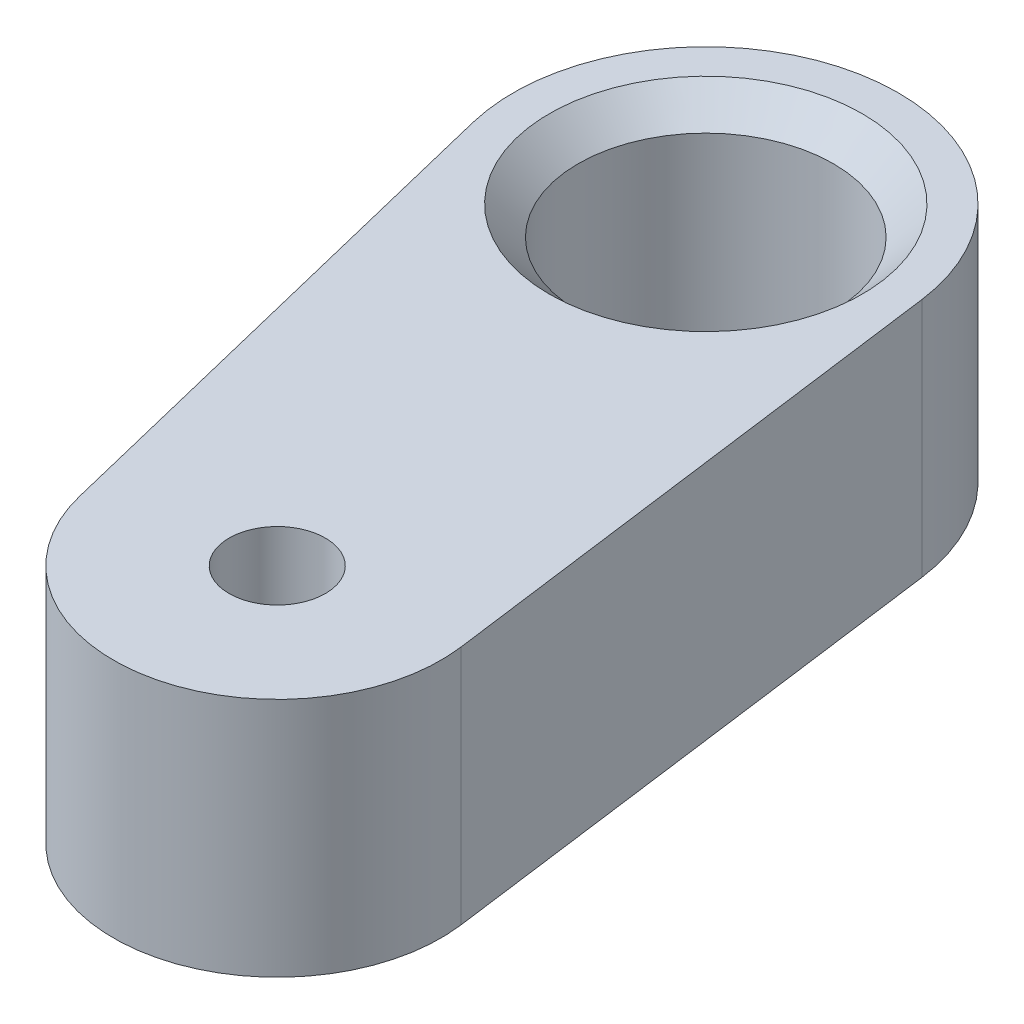
ISO-10303-21;
HEADER;
FILE_DESCRIPTION(('STEP AP214'),'2;1');
FILE_NAME('part.step','',(''),(''),'','','');
FILE_SCHEMA(('AUTOMOTIVE_DESIGN { 1 0 10303 214 1 1 1 1 }'));
ENDSEC;
DATA;
#1=APPLICATION_CONTEXT('core data for automotive mechanical design processes');
#2=APPLICATION_PROTOCOL_DEFINITION('international standard','automotive_design',2000,#1);
#3=PRODUCT_CONTEXT('',#1,'mechanical');
#4=PRODUCT('Part','Part','',(#3));
#5=PRODUCT_RELATED_PRODUCT_CATEGORY('part','',(#4));
#6=PRODUCT_DEFINITION_FORMATION('','',#4);
#7=PRODUCT_DEFINITION_CONTEXT('part definition',#1,'design');
#8=PRODUCT_DEFINITION('design','',#6,#7);
#9=PRODUCT_DEFINITION_SHAPE('','',#8);
#10=(LENGTH_UNIT() NAMED_UNIT(*) SI_UNIT(.MILLI.,.METRE.));
#11=(NAMED_UNIT(*) PLANE_ANGLE_UNIT() SI_UNIT($,.RADIAN.));
#12=(NAMED_UNIT(*) SI_UNIT($,.STERADIAN.) SOLID_ANGLE_UNIT());
#13=UNCERTAINTY_MEASURE_WITH_UNIT(LENGTH_MEASURE(1.E-05),#10,'distance_accuracy_value','');
#14=(GEOMETRIC_REPRESENTATION_CONTEXT(3) GLOBAL_UNCERTAINTY_ASSIGNED_CONTEXT((#13)) GLOBAL_UNIT_ASSIGNED_CONTEXT((#10,
#11,#12)) REPRESENTATION_CONTEXT('',''));
#15=CARTESIAN_POINT('',(0.,0.,0.));
#16=DIRECTION('',(0.,0.,1.));
#17=DIRECTION('',(1.,0.,0.));
#18=AXIS2_PLACEMENT_3D('',#15,#16,#17);
#19=CARTESIAN_POINT('',(0.,36.2,0.));
#20=DIRECTION('',(0.,-1.,0.));
#21=DIRECTION('',(0.,0.,-1.));
#22=AXIS2_PLACEMENT_3D('',#19,#20,#21);
#23=CYLINDRICAL_SURFACE('',#22,4.);
#24=CARTESIAN_POINT('',(0.,33.,0.));
#25=DIRECTION('',(0.,1.,0.));
#26=DIRECTION('',(0.,0.,1.));
#27=AXIS2_PLACEMENT_3D('',#24,#25,#26);
#28=CIRCLE('',#27,4.);
#29=CARTESIAN_POINT('',(3.96526743426604,33.,-0.52597925315473));
#30=VERTEX_POINT('',#29);
#31=CARTESIAN_POINT('',(-3.8858232577105,33.,0.948882295037764));
#32=VERTEX_POINT('',#31);
#33=EDGE_CURVE('E112',#30,#32,#28,.T.);
#34=ORIENTED_EDGE('',*,*,#33,.T.);
#35=DIRECTION('',(0.,-1.,0.));
#36=VECTOR('',#35,1.);
#37=CARTESIAN_POINT('',(-3.8858232577105,36.2,0.948882295037764));
#38=LINE('',#37,#36);
#39=CARTESIAN_POINT('',(-3.8858232577105,38.,0.948882295037763));
#40=VERTEX_POINT('',#39);
#41=EDGE_CURVE('E109',#40,#32,#38,.T.);
#42=ORIENTED_EDGE('',*,*,#41,.F.);
#43=CARTESIAN_POINT('',(0.,38.,0.));
#44=DIRECTION('',(0.,1.,0.));
#45=DIRECTION('',(0.,0.,1.));
#46=AXIS2_PLACEMENT_3D('',#43,#44,#45);
#47=CIRCLE('',#46,4.);
#48=CARTESIAN_POINT('',(3.96526743426604,38.,-0.52597925315473));
#49=VERTEX_POINT('',#48);
#50=EDGE_CURVE('E111',#49,#40,#47,.T.);
#51=ORIENTED_EDGE('',*,*,#50,.F.);
#52=DIRECTION('',(0.,-1.,0.));
#53=VECTOR('',#52,1.);
#54=CARTESIAN_POINT('',(3.96526743426604,36.2,-0.52597925315473));
#55=LINE('',#54,#53);
#56=EDGE_CURVE('E83',#49,#30,#55,.T.);
#57=ORIENTED_EDGE('',*,*,#56,.T.);
#58=EDGE_LOOP('',(#34,#42,#51,#57));
#59=FACE_BOUND('',#58,.T.);
#60=ADVANCED_FACE('F68',(#59),#23,.T.);
#61=CARTESIAN_POINT('',(-3.8858232577105,36.2,0.948882295037763));
#62=DIRECTION('',(0.971455814427626,0.,-0.237220573759441));
#63=DIRECTION('',(-0.237220573759441,0.,-0.971455814427626));
#64=AXIS2_PLACEMENT_3D('',#61,#62,#63);
#65=PLANE('',#64);
#66=DIRECTION('',(0.237220573759441,0.,0.971455814427626));
#67=VECTOR('',#66,1.);
#68=CARTESIAN_POINT('',(-3.8858232577105,33.,0.948882295037763));
#69=LINE('',#68,#67);
#70=CARTESIAN_POINT('',(-1.24345838330055,33.,11.7697848854174));
#71=VERTEX_POINT('',#70);
#72=EDGE_CURVE('E143',#32,#71,#69,.T.);
#73=ORIENTED_EDGE('',*,*,#72,.T.);
#74=DIRECTION('',(0.,-1.,0.));
#75=VECTOR('',#74,1.);
#76=CARTESIAN_POINT('',(-1.24345838330055,36.2,11.7697848854174));
#77=LINE('',#76,#75);
#78=CARTESIAN_POINT('',(-1.24345838330055,38.,11.7697848854174));
#79=VERTEX_POINT('',#78);
#80=EDGE_CURVE('E116',#79,#71,#77,.T.);
#81=ORIENTED_EDGE('',*,*,#80,.F.);
#82=DIRECTION('',(-0.237220573759441,0.,-0.971455814427626));
#83=VECTOR('',#82,1.);
#84=CARTESIAN_POINT('',(-3.8858232577105,38.,0.948882295037763));
#85=LINE('',#84,#83);
#86=EDGE_CURVE('E123',#79,#40,#85,.T.);
#87=ORIENTED_EDGE('',*,*,#86,.T.);
#88=ORIENTED_EDGE('',*,*,#41,.T.);
#89=EDGE_LOOP('',(#73,#81,#87,#88));
#90=FACE_BOUND('',#89,.T.);
#91=ADVANCED_FACE('F126',(#90),#65,.F.);
#92=CARTESIAN_POINT('',(2.05949138575338,36.2,10.9632349346353));
#93=DIRECTION('',(0.,-1.,0.));
#94=DIRECTION('',(0.,0.,-1.));
#95=AXIS2_PLACEMENT_3D('',#92,#93,#94);
#96=CYLINDRICAL_SURFACE('',#95,3.4);
#97=CARTESIAN_POINT('',(2.05949138575338,33.,10.9632349346353));
#98=DIRECTION('',(0.,1.,0.));
#99=DIRECTION('',(0.,0.,1.));
#100=AXIS2_PLACEMENT_3D('',#97,#98,#99);
#101=CIRCLE('',#100,3.4);
#102=CARTESIAN_POINT('',(5.42996870487952,33.,10.5161525694538));
#103=VERTEX_POINT('',#102);
#104=EDGE_CURVE('E145',#71,#103,#101,.T.);
#105=ORIENTED_EDGE('',*,*,#104,.T.);
#106=DIRECTION('',(0.,-1.,0.));
#107=VECTOR('',#106,1.);
#108=CARTESIAN_POINT('',(5.42996870487952,36.2,10.5161525694538));
#109=LINE('',#108,#107);
#110=CARTESIAN_POINT('',(5.42996870487952,38.,10.5161525694538));
#111=VERTEX_POINT('',#110);
#112=EDGE_CURVE('E91',#111,#103,#109,.T.);
#113=ORIENTED_EDGE('',*,*,#112,.F.);
#114=CARTESIAN_POINT('',(2.05949138575338,38.,10.9632349346353));
#115=DIRECTION('',(0.,1.,0.));
#116=DIRECTION('',(0.,0.,1.));
#117=AXIS2_PLACEMENT_3D('',#114,#115,#116);
#118=CIRCLE('',#117,3.4);
#119=EDGE_CURVE('E137',#79,#111,#118,.T.);
#120=ORIENTED_EDGE('',*,*,#119,.F.);
#121=ORIENTED_EDGE('',*,*,#80,.T.);
#122=EDGE_LOOP('',(#105,#113,#120,#121));
#123=FACE_BOUND('',#122,.T.);
#124=ADVANCED_FACE('F183',(#123),#96,.T.);
#125=CARTESIAN_POINT('',(3.96526743426604,36.2,-0.52597925315473));
#126=DIRECTION('',(0.99131685856651,0.,-0.131494813288683));
#127=DIRECTION('',(-0.131494813288683,0.,-0.99131685856651));
#128=AXIS2_PLACEMENT_3D('',#125,#126,#127);
#129=PLANE('',#128);
#130=DIRECTION('',(0.131494813288683,0.,0.99131685856651));
#131=VECTOR('',#130,1.);
#132=CARTESIAN_POINT('',(3.96526743426604,33.,-0.52597925315473));
#133=LINE('',#132,#131);
#134=EDGE_CURVE('E147',#30,#103,#133,.T.);
#135=ORIENTED_EDGE('',*,*,#134,.F.);
#136=ORIENTED_EDGE('',*,*,#56,.F.);
#137=DIRECTION('',(-0.131494813288683,0.,-0.99131685856651));
#138=VECTOR('',#137,1.);
#139=CARTESIAN_POINT('',(3.96526743426604,38.,-0.52597925315473));
#140=LINE('',#139,#138);
#141=EDGE_CURVE('E124',#111,#49,#140,.T.);
#142=ORIENTED_EDGE('',*,*,#141,.F.);
#143=ORIENTED_EDGE('',*,*,#112,.T.);
#144=EDGE_LOOP('',(#135,#136,#142,#143));
#145=FACE_BOUND('',#144,.T.);
#146=ADVANCED_FACE('F191',(#145),#129,.T.);
#147=CARTESIAN_POINT('',(0.,36.2,0.));
#148=DIRECTION('',(0.,-1.,0.));
#149=DIRECTION('',(0.,0.,-1.));
#150=AXIS2_PLACEMENT_3D('',#147,#148,#149);
#151=CYLINDRICAL_SURFACE('',#150,2.65);
#152=CARTESIAN_POINT('',(0.,37.4,0.));
#153=DIRECTION('',(0.,1.,0.));
#154=DIRECTION('',(0.,0.,1.));
#155=AXIS2_PLACEMENT_3D('',#152,#153,#154);
#156=CIRCLE('',#155,2.65);
#157=CARTESIAN_POINT('',(0.,37.4,2.65));
#158=VERTEX_POINT('',#157);
#159=EDGE_CURVE('E155',#158,#158,#156,.T.);
#160=ORIENTED_EDGE('',*,*,#159,.T.);
#161=EDGE_LOOP('',(#160));
#162=FACE_BOUND('',#161,.T.);
#163=CARTESIAN_POINT('',(0.,33.6,0.));
#164=DIRECTION('',(0.,1.,0.));
#165=DIRECTION('',(0.,0.,1.));
#166=AXIS2_PLACEMENT_3D('',#163,#164,#165);
#167=CIRCLE('',#166,2.65);
#168=CARTESIAN_POINT('',(0.,33.6,2.65));
#169=VERTEX_POINT('',#168);
#170=EDGE_CURVE('E115',#169,#169,#167,.F.);
#171=ORIENTED_EDGE('',*,*,#170,.T.);
#172=EDGE_LOOP('',(#171));
#173=FACE_BOUND('',#172,.T.);
#174=ADVANCED_FACE('F187',(#162,#173),#151,.F.);
#175=CARTESIAN_POINT('',(2.05949138575338,36.2,10.9632349346353));
#176=DIRECTION('',(0.,-1.,0.));
#177=DIRECTION('',(0.,0.,-1.));
#178=AXIS2_PLACEMENT_3D('',#175,#176,#177);
#179=CYLINDRICAL_SURFACE('',#178,2.6);
#180=CARTESIAN_POINT('',(2.05949138575338,33.4,10.9632349346353));
#181=DIRECTION('',(0.,1.,0.));
#182=DIRECTION('',(0.,0.,1.));
#183=AXIS2_PLACEMENT_3D('',#180,#181,#182);
#184=CIRCLE('',#183,2.6);
#185=CARTESIAN_POINT('',(2.05949138575338,33.4,13.5632349346353));
#186=VERTEX_POINT('',#185);
#187=EDGE_CURVE('E12',#186,#186,#184,.F.);
#188=ORIENTED_EDGE('',*,*,#187,.T.);
#189=EDGE_LOOP('',(#188));
#190=FACE_BOUND('',#189,.T.);
#191=CARTESIAN_POINT('',(2.05949138575338,36.2,10.9632349346353));
#192=DIRECTION('',(0.,1.,0.));
#193=DIRECTION('',(0.,0.,1.));
#194=AXIS2_PLACEMENT_3D('',#191,#192,#193);
#195=CIRCLE('',#194,2.6);
#196=CARTESIAN_POINT('',(2.05949138575338,36.2,13.5632349346353));
#197=VERTEX_POINT('',#196);
#198=EDGE_CURVE('E139',#197,#197,#195,.T.);
#199=ORIENTED_EDGE('',*,*,#198,.T.);
#200=EDGE_LOOP('',(#199));
#201=FACE_BOUND('',#200,.T.);
#202=ADVANCED_FACE('F190',(#190,#201),#179,.F.);
#203=CARTESIAN_POINT('',(0.,33.,0.));
#204=DIRECTION('',(0.,1.,0.));
#205=DIRECTION('',(0.,0.,1.));
#206=AXIS2_PLACEMENT_3D('',#203,#204,#205);
#207=PLANE('',#206);
#208=CARTESIAN_POINT('',(2.05949138575338,33.,10.9632349346353));
#209=DIRECTION('',(0.,1.,0.));
#210=DIRECTION('',(0.,0.,1.));
#211=AXIS2_PLACEMENT_3D('',#208,#209,#210);
#212=CIRCLE('',#211,3.);
#213=CARTESIAN_POINT('',(2.05949138575338,33.,13.9632349346353));
#214=VERTEX_POINT('',#213);
#215=EDGE_CURVE('E76',#214,#214,#212,.T.);
#216=ORIENTED_EDGE('',*,*,#215,.T.);
#217=EDGE_LOOP('',(#216));
#218=FACE_BOUND('',#217,.T.);
#219=CARTESIAN_POINT('',(0.,33.,0.));
#220=DIRECTION('',(0.,1.,0.));
#221=DIRECTION('',(0.,0.,1.));
#222=AXIS2_PLACEMENT_3D('',#219,#220,#221);
#223=CIRCLE('',#222,3.25);
#224=CARTESIAN_POINT('',(0.,33.,3.25));
#225=VERTEX_POINT('',#224);
#226=EDGE_CURVE('E161',#225,#225,#223,.T.);
#227=ORIENTED_EDGE('',*,*,#226,.T.);
#228=EDGE_LOOP('',(#227));
#229=FACE_BOUND('',#228,.T.);
#230=ORIENTED_EDGE('',*,*,#33,.F.);
#231=ORIENTED_EDGE('',*,*,#134,.T.);
#232=ORIENTED_EDGE('',*,*,#104,.F.);
#233=ORIENTED_EDGE('',*,*,#72,.F.);
#234=EDGE_LOOP('',(#230,#231,#232,#233));
#235=FACE_BOUND('',#234,.T.);
#236=ADVANCED_FACE('F166',(#218,#229,#235),#207,.F.);
#237=CARTESIAN_POINT('',(0.,36.2,0.));
#238=DIRECTION('',(0.,1.,0.));
#239=DIRECTION('',(0.,0.,1.));
#240=AXIS2_PLACEMENT_3D('',#237,#238,#239);
#241=PLANE('',#240);
#242=CARTESIAN_POINT('',(2.05949138575338,36.2,10.9632349346353));
#243=DIRECTION('',(0.,1.,0.));
#244=DIRECTION('',(0.,0.,1.));
#245=AXIS2_PLACEMENT_3D('',#242,#243,#244);
#246=CIRCLE('',#245,1.);
#247=CARTESIAN_POINT('',(2.05949138575338,36.2,11.9632349346353));
#248=VERTEX_POINT('',#247);
#249=EDGE_CURVE('E132',#248,#248,#246,.T.);
#250=ORIENTED_EDGE('',*,*,#249,.T.);
#251=EDGE_LOOP('',(#250));
#252=FACE_BOUND('',#251,.T.);
#253=ORIENTED_EDGE('',*,*,#198,.F.);
#254=EDGE_LOOP('',(#253));
#255=FACE_BOUND('',#254,.T.);
#256=ADVANCED_FACE('F216',(#252,#255),#241,.F.);
#257=CARTESIAN_POINT('',(0.,38.,0.));
#258=DIRECTION('',(0.,1.,0.));
#259=DIRECTION('',(0.,0.,1.));
#260=AXIS2_PLACEMENT_3D('',#257,#258,#259);
#261=PLANE('',#260);
#262=CARTESIAN_POINT('',(0.,38.,0.));
#263=DIRECTION('',(0.,1.,0.));
#264=DIRECTION('',(0.,0.,1.));
#265=AXIS2_PLACEMENT_3D('',#262,#263,#264);
#266=CIRCLE('',#265,3.25);
#267=CARTESIAN_POINT('',(0.,38.,3.25));
#268=VERTEX_POINT('',#267);
#269=EDGE_CURVE('E158',#268,#268,#266,.F.);
#270=ORIENTED_EDGE('',*,*,#269,.T.);
#271=EDGE_LOOP('',(#270));
#272=FACE_BOUND('',#271,.T.);
#273=CARTESIAN_POINT('',(2.05949138575338,38.,10.9632349346353));
#274=DIRECTION('',(0.,1.,0.));
#275=DIRECTION('',(0.,0.,1.));
#276=AXIS2_PLACEMENT_3D('',#273,#274,#275);
#277=CIRCLE('',#276,1.);
#278=CARTESIAN_POINT('',(2.05949138575338,38.,11.9632349346353));
#279=VERTEX_POINT('',#278);
#280=EDGE_CURVE('E129',#279,#279,#277,.T.);
#281=ORIENTED_EDGE('',*,*,#280,.F.);
#282=EDGE_LOOP('',(#281));
#283=FACE_BOUND('',#282,.T.);
#284=ORIENTED_EDGE('',*,*,#86,.F.);
#285=ORIENTED_EDGE('',*,*,#119,.T.);
#286=ORIENTED_EDGE('',*,*,#141,.T.);
#287=ORIENTED_EDGE('',*,*,#50,.T.);
#288=EDGE_LOOP('',(#284,#285,#286,#287));
#289=FACE_BOUND('',#288,.T.);
#290=ADVANCED_FACE('F121',(#272,#283,#289),#261,.T.);
#291=CARTESIAN_POINT('',(2.05949138575338,38.,10.9632349346353));
#292=DIRECTION('',(0.,-1.,0.));
#293=DIRECTION('',(0.,0.,-1.));
#294=AXIS2_PLACEMENT_3D('',#291,#292,#293);
#295=CYLINDRICAL_SURFACE('',#294,1.);
#296=ORIENTED_EDGE('',*,*,#280,.T.);
#297=EDGE_LOOP('',(#296));
#298=FACE_BOUND('',#297,.T.);
#299=ORIENTED_EDGE('',*,*,#249,.F.);
#300=EDGE_LOOP('',(#299));
#301=FACE_BOUND('',#300,.T.);
#302=ADVANCED_FACE('F198',(#298,#301),#295,.F.);
#303=CARTESIAN_POINT('',(0.,37.4,0.));
#304=DIRECTION('',(0.,1.,0.));
#305=DIRECTION('',(0.,0.,1.));
#306=AXIS2_PLACEMENT_3D('',#303,#304,#305);
#307=CONICAL_SURFACE('',#306,2.65,0.785398163397442);
#308=CARTESIAN_POINT('',(0.,38.,3.25));
#309=CARTESIAN_POINT('',(0.,37.99375,3.24375));
#310=CARTESIAN_POINT('',(0.,37.9875,3.2375));
#311=CARTESIAN_POINT('',(0.,37.975,3.225));
#312=CARTESIAN_POINT('',(0.,37.96875,3.21875));
#313=CARTESIAN_POINT('',(0.,37.95625,3.20625));
#314=CARTESIAN_POINT('',(0.,37.95,3.2));
#315=CARTESIAN_POINT('',(0.,37.9375,3.1875));
#316=CARTESIAN_POINT('',(0.,37.93125,3.18125));
#317=CARTESIAN_POINT('',(0.,37.91875,3.16875));
#318=CARTESIAN_POINT('',(0.,37.9125,3.1625));
#319=CARTESIAN_POINT('',(0.,37.9,3.15));
#320=CARTESIAN_POINT('',(0.,37.89375,3.14375));
#321=CARTESIAN_POINT('',(0.,37.88125,3.13125));
#322=CARTESIAN_POINT('',(0.,37.875,3.125));
#323=CARTESIAN_POINT('',(0.,37.8625,3.1125));
#324=CARTESIAN_POINT('',(0.,37.85625,3.10625));
#325=CARTESIAN_POINT('',(0.,37.84375,3.09375));
#326=CARTESIAN_POINT('',(0.,37.8375,3.0875));
#327=CARTESIAN_POINT('',(0.,37.825,3.075));
#328=CARTESIAN_POINT('',(0.,37.81875,3.06875));
#329=CARTESIAN_POINT('',(0.,37.80625,3.05625));
#330=CARTESIAN_POINT('',(0.,37.8,3.05));
#331=CARTESIAN_POINT('',(0.,37.7875,3.0375));
#332=CARTESIAN_POINT('',(0.,37.78125,3.03125));
#333=CARTESIAN_POINT('',(0.,37.76875,3.01875));
#334=CARTESIAN_POINT('',(0.,37.7625,3.0125));
#335=CARTESIAN_POINT('',(0.,37.75,3.));
#336=CARTESIAN_POINT('',(0.,37.74375,2.99375));
#337=CARTESIAN_POINT('',(0.,37.73125,2.98125));
#338=CARTESIAN_POINT('',(0.,37.725,2.975));
#339=CARTESIAN_POINT('',(0.,37.7125,2.9625));
#340=CARTESIAN_POINT('',(0.,37.70625,2.95625));
#341=CARTESIAN_POINT('',(0.,37.69375,2.94375));
#342=CARTESIAN_POINT('',(0.,37.6875,2.9375));
#343=CARTESIAN_POINT('',(0.,37.675,2.925));
#344=CARTESIAN_POINT('',(0.,37.66875,2.91875));
#345=CARTESIAN_POINT('',(0.,37.65625,2.90625));
#346=CARTESIAN_POINT('',(0.,37.65,2.9));
#347=CARTESIAN_POINT('',(0.,37.6375,2.8875));
#348=CARTESIAN_POINT('',(0.,37.63125,2.88125));
#349=CARTESIAN_POINT('',(0.,37.61875,2.86875));
#350=CARTESIAN_POINT('',(0.,37.6125,2.8625));
#351=CARTESIAN_POINT('',(0.,37.6,2.85));
#352=CARTESIAN_POINT('',(0.,37.59375,2.84375));
#353=CARTESIAN_POINT('',(0.,37.58125,2.83125));
#354=CARTESIAN_POINT('',(0.,37.575,2.825));
#355=CARTESIAN_POINT('',(0.,37.5625,2.8125));
#356=CARTESIAN_POINT('',(0.,37.55625,2.80625));
#357=CARTESIAN_POINT('',(0.,37.54375,2.79375));
#358=CARTESIAN_POINT('',(0.,37.5375,2.7875));
#359=CARTESIAN_POINT('',(0.,37.525,2.775));
#360=CARTESIAN_POINT('',(0.,37.51875,2.76875));
#361=CARTESIAN_POINT('',(0.,37.50625,2.75625));
#362=CARTESIAN_POINT('',(0.,37.5,2.75));
#363=CARTESIAN_POINT('',(0.,37.4875,2.7375));
#364=CARTESIAN_POINT('',(0.,37.48125,2.73125));
#365=CARTESIAN_POINT('',(0.,37.46875,2.71875));
#366=CARTESIAN_POINT('',(0.,37.4625,2.7125));
#367=CARTESIAN_POINT('',(0.,37.45,2.7));
#368=CARTESIAN_POINT('',(0.,37.44375,2.69375));
#369=CARTESIAN_POINT('',(0.,37.43125,2.68125));
#370=CARTESIAN_POINT('',(0.,37.425,2.675));
#371=CARTESIAN_POINT('',(0.,37.4125,2.6625));
#372=CARTESIAN_POINT('',(0.,37.40625,2.65625));
#373=CARTESIAN_POINT('',(0.,37.4,2.65));
#374=B_SPLINE_CURVE_WITH_KNOTS('',3,(#308,#309,#310,#311,#312,#313,#314,#315,#316,#317,#318,
#319,#320,#321,#322,#323,#324,#325,#326,#327,#328,#329,#330,#331,#332,#333,#334,#335,#336,#337,
#338,#339,#340,#341,#342,#343,#344,#345,#346,#347,#348,#349,#350,#351,#352,#353,#354,#355,#356,
#357,#358,#359,#360,#361,#362,#363,#364,#365,#366,#367,#368,#369,#370,#371,#372,#373),
.UNSPECIFIED.,.F.,.F.,(4,2,2,2,2,2,2,2,2,2,2,2,2,2,2,2,2,2,2,2,2,2,2,2,2,2,2,2,2,2,2,2,4),(0.,
0.0265165042944941,0.0530330085889883,0.0795495128834873,0.106066017177981,0.132582521472476,
0.159099025766975,0.185615530061469,0.212132034355963,0.238648538650462,0.265165042944956,
0.29168154723945,0.318198051533949,0.344714555828444,0.371231060122938,0.397747564417437,
0.424264068711931,0.450780573006425,0.477297077300924,0.503813581595418,0.530330085889912,
0.556846590184411,0.583363094478905,0.609879598773399,0.636396103067899,0.662912607362393,
0.689429111656887,0.715945615951386,0.74246212024588,0.768978624540374,0.795495128834873,
0.822011633129367,0.848528137423862),.UNSPECIFIED.);
#375=EDGE_CURVE('BSEAM175',#268,#158,#374,.T.);
#376=ORIENTED_EDGE('',*,*,#269,.F.);
#377=ORIENTED_EDGE('',*,*,#159,.F.);
#378=ORIENTED_EDGE('',*,*,#375,.T.);
#379=ORIENTED_EDGE('',*,*,#375,.F.);
#380=EDGE_LOOP('',(#376,#378,#377,#379));
#381=FACE_BOUND('',#380,.T.);
#382=ADVANCED_FACE('F175',(#381),#307,.F.);
#383=CARTESIAN_POINT('',(0.,33.,0.));
#384=DIRECTION('',(0.,-1.,0.));
#385=DIRECTION('',(0.,0.,-1.));
#386=AXIS2_PLACEMENT_3D('',#383,#384,#385);
#387=CONICAL_SURFACE('',#386,3.25,0.785398163397448);
#388=ORIENTED_EDGE('',*,*,#170,.F.);
#389=EDGE_LOOP('',(#388));
#390=FACE_BOUND('',#389,.T.);
#391=ORIENTED_EDGE('',*,*,#226,.F.);
#392=EDGE_LOOP('',(#391));
#393=FACE_BOUND('',#392,.T.);
#394=ADVANCED_FACE('F170',(#390,#393),#387,.F.);
#395=CARTESIAN_POINT('',(2.05949138575338,33.4,10.9632349346353));
#396=DIRECTION('',(0.,1.,0.));
#397=DIRECTION('',(0.,0.,1.));
#398=AXIS2_PLACEMENT_3D('',#395,#396,#397);
#399=TOROIDAL_SURFACE('',#398,3.,0.4);
#400=ORIENTED_EDGE('',*,*,#187,.F.);
#401=EDGE_LOOP('',(#400));
#402=FACE_BOUND('',#401,.T.);
#403=ORIENTED_EDGE('',*,*,#215,.F.);
#404=EDGE_LOOP('',(#403));
#405=FACE_BOUND('',#404,.T.);
#406=ADVANCED_FACE('F70',(#402,#405),#399,.T.);
#407=CLOSED_SHELL('',(#60,#91,#124,#146,#174,#202,#236,#256,#290,#302,#382,#394,#406));
#408=MANIFOLD_SOLID_BREP('B2',#407);
#409=ADVANCED_BREP_SHAPE_REPRESENTATION('',(#18,#408),#14);
#410=SHAPE_DEFINITION_REPRESENTATION(#9,#409);
ENDSEC;
END-ISO-10303-21;
